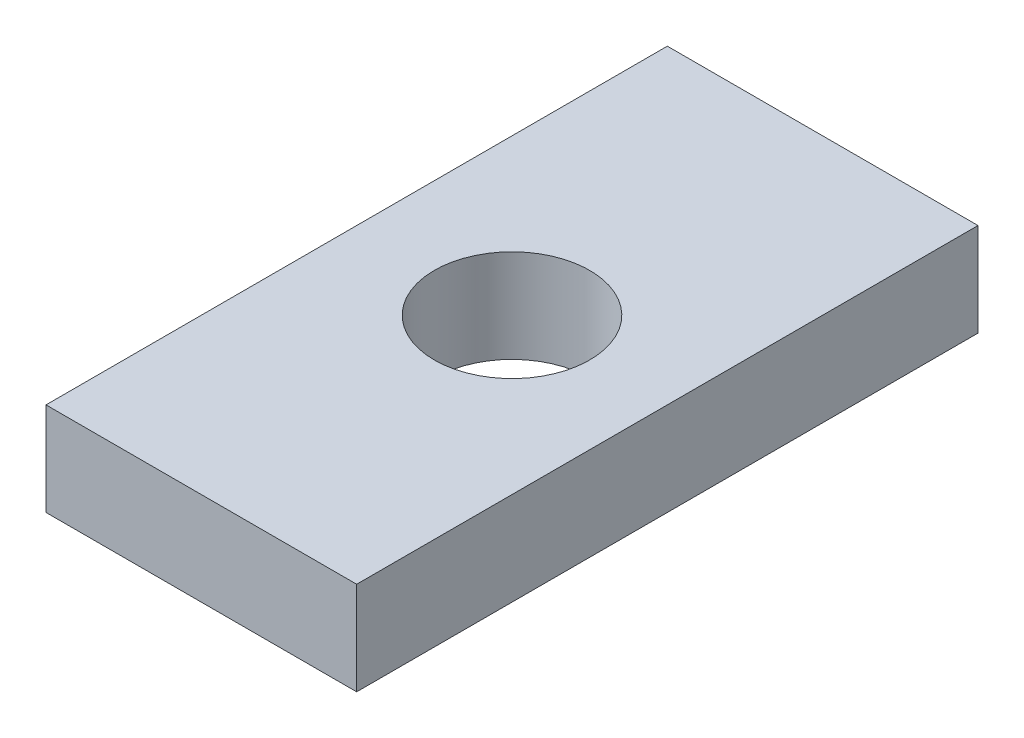
ISO-10303-21;
HEADER;
FILE_DESCRIPTION(('STEP AP214'),'2;1');
FILE_NAME('part.step','',(''),(''),'','','');
FILE_SCHEMA(('AUTOMOTIVE_DESIGN { 1 0 10303 214 1 1 1 1 }'));
ENDSEC;
DATA;
#1=APPLICATION_CONTEXT('core data for automotive mechanical design processes');
#2=APPLICATION_PROTOCOL_DEFINITION('international standard','automotive_design',2000,#1);
#3=PRODUCT_CONTEXT('',#1,'mechanical');
#4=PRODUCT('Part','Part','',(#3));
#5=PRODUCT_RELATED_PRODUCT_CATEGORY('part','',(#4));
#6=PRODUCT_DEFINITION_FORMATION('','',#4);
#7=PRODUCT_DEFINITION_CONTEXT('part definition',#1,'design');
#8=PRODUCT_DEFINITION('design','',#6,#7);
#9=PRODUCT_DEFINITION_SHAPE('','',#8);
#10=(LENGTH_UNIT() NAMED_UNIT(*) SI_UNIT(.MILLI.,.METRE.));
#11=(NAMED_UNIT(*) PLANE_ANGLE_UNIT() SI_UNIT($,.RADIAN.));
#12=(NAMED_UNIT(*) SI_UNIT($,.STERADIAN.) SOLID_ANGLE_UNIT());
#13=UNCERTAINTY_MEASURE_WITH_UNIT(LENGTH_MEASURE(1.E-05),#10,'distance_accuracy_value','');
#14=(GEOMETRIC_REPRESENTATION_CONTEXT(3) GLOBAL_UNCERTAINTY_ASSIGNED_CONTEXT((#13)) GLOBAL_UNIT_ASSIGNED_CONTEXT((#10,
#11,#12)) REPRESENTATION_CONTEXT('',''));
#15=CARTESIAN_POINT('',(0.,0.,0.));
#16=DIRECTION('',(0.,0.,1.));
#17=DIRECTION('',(1.,0.,0.));
#18=AXIS2_PLACEMENT_3D('',#15,#16,#17);
#19=CARTESIAN_POINT('',(0.,3.,0.));
#20=DIRECTION('',(0.,1.,0.));
#21=DIRECTION('',(0.,0.,1.));
#22=AXIS2_PLACEMENT_3D('',#19,#20,#21);
#23=PLANE('',#22);
#24=DIRECTION('',(0.,0.,1.));
#25=VECTOR('',#24,1.);
#26=CARTESIAN_POINT('',(-10.919540229885,3.,-6.60919540229885));
#27=LINE('',#26,#25);
#28=CARTESIAN_POINT('',(-10.919540229885,3.,-6.60919540229885));
#29=VERTEX_POINT('',#28);
#30=CARTESIAN_POINT('',(-10.919540229885,3.,13.3908045977012));
#31=VERTEX_POINT('',#30);
#32=EDGE_CURVE('E85',#29,#31,#27,.T.);
#33=ORIENTED_EDGE('',*,*,#32,.T.);
#34=DIRECTION('',(1.,0.,0.));
#35=VECTOR('',#34,1.);
#36=CARTESIAN_POINT('',(-10.919540229885,3.,13.3908045977012));
#37=LINE('',#36,#35);
#38=CARTESIAN_POINT('',(-0.919540229885045,3.,13.3908045977012));
#39=VERTEX_POINT('',#38);
#40=EDGE_CURVE('E80',#31,#39,#37,.T.);
#41=ORIENTED_EDGE('',*,*,#40,.T.);
#42=DIRECTION('',(0.,0.,-1.));
#43=VECTOR('',#42,1.);
#44=CARTESIAN_POINT('',(-0.919540229885047,3.,-6.60919540229885));
#45=LINE('',#44,#43);
#46=CARTESIAN_POINT('',(-0.919540229885047,3.,-6.60919540229885));
#47=VERTEX_POINT('',#46);
#48=EDGE_CURVE('E83',#39,#47,#45,.T.);
#49=ORIENTED_EDGE('',*,*,#48,.T.);
#50=DIRECTION('',(-1.,0.,0.));
#51=VECTOR('',#50,1.);
#52=CARTESIAN_POINT('',(-10.919540229885,3.,-6.60919540229885));
#53=LINE('',#52,#51);
#54=EDGE_CURVE('E50',#47,#29,#53,.T.);
#55=ORIENTED_EDGE('',*,*,#54,.T.);
#56=EDGE_LOOP('',(#33,#41,#49,#55));
#57=FACE_BOUND('',#56,.T.);
#58=CARTESIAN_POINT('',(-5.91954022988505,3.,3.39080459770115));
#59=DIRECTION('',(0.,1.,0.));
#60=DIRECTION('',(0.,0.,1.));
#61=AXIS2_PLACEMENT_3D('',#58,#59,#60);
#62=CIRCLE('',#61,2.5);
#63=CARTESIAN_POINT('',(-5.91954022988505,3.,5.89080459770115));
#64=VERTEX_POINT('',#63);
#65=EDGE_CURVE('E100',#64,#64,#62,.T.);
#66=ORIENTED_EDGE('',*,*,#65,.F.);
#67=EDGE_LOOP('',(#66));
#68=FACE_BOUND('',#67,.T.);
#69=ADVANCED_FACE('F33',(#57,#68),#23,.T.);
#70=CARTESIAN_POINT('',(0.,0.,0.));
#71=DIRECTION('',(0.,1.,0.));
#72=DIRECTION('',(0.,0.,1.));
#73=AXIS2_PLACEMENT_3D('',#70,#71,#72);
#74=PLANE('',#73);
#75=DIRECTION('',(0.,0.,1.));
#76=VECTOR('',#75,1.);
#77=CARTESIAN_POINT('',(-10.919540229885,0.,-6.60919540229885));
#78=LINE('',#77,#76);
#79=CARTESIAN_POINT('',(-10.919540229885,0.,-6.60919540229885));
#80=VERTEX_POINT('',#79);
#81=CARTESIAN_POINT('',(-10.919540229885,0.,13.3908045977012));
#82=VERTEX_POINT('',#81);
#83=EDGE_CURVE('E97',#80,#82,#78,.T.);
#84=ORIENTED_EDGE('',*,*,#83,.F.);
#85=DIRECTION('',(-1.,0.,0.));
#86=VECTOR('',#85,1.);
#87=CARTESIAN_POINT('',(-10.919540229885,0.,-6.60919540229885));
#88=LINE('',#87,#86);
#89=CARTESIAN_POINT('',(-0.919540229885047,0.,-6.60919540229885));
#90=VERTEX_POINT('',#89);
#91=EDGE_CURVE('E73',#90,#80,#88,.T.);
#92=ORIENTED_EDGE('',*,*,#91,.F.);
#93=DIRECTION('',(0.,0.,-1.));
#94=VECTOR('',#93,1.);
#95=CARTESIAN_POINT('',(-0.919540229885047,0.,-6.60919540229885));
#96=LINE('',#95,#94);
#97=CARTESIAN_POINT('',(-0.919540229885045,0.,13.3908045977012));
#98=VERTEX_POINT('',#97);
#99=EDGE_CURVE('E67',#98,#90,#96,.T.);
#100=ORIENTED_EDGE('',*,*,#99,.F.);
#101=DIRECTION('',(1.,0.,0.));
#102=VECTOR('',#101,1.);
#103=CARTESIAN_POINT('',(-10.919540229885,0.,13.3908045977012));
#104=LINE('',#103,#102);
#105=EDGE_CURVE('E89',#82,#98,#104,.T.);
#106=ORIENTED_EDGE('',*,*,#105,.F.);
#107=EDGE_LOOP('',(#84,#92,#100,#106));
#108=FACE_BOUND('',#107,.T.);
#109=CARTESIAN_POINT('',(-5.91954022988505,0.,3.39080459770115));
#110=DIRECTION('',(0.,1.,0.));
#111=DIRECTION('',(0.,0.,1.));
#112=AXIS2_PLACEMENT_3D('',#109,#110,#111);
#113=CIRCLE('',#112,2.5);
#114=CARTESIAN_POINT('',(-5.91954022988505,0.,5.89080459770115));
#115=VERTEX_POINT('',#114);
#116=EDGE_CURVE('E112',#115,#115,#113,.T.);
#117=ORIENTED_EDGE('',*,*,#116,.T.);
#118=EDGE_LOOP('',(#117));
#119=FACE_BOUND('',#118,.T.);
#120=ADVANCED_FACE('F108',(#108,#119),#74,.F.);
#121=CARTESIAN_POINT('',(-10.919540229885,3.,-6.60919540229885));
#122=DIRECTION('',(1.,0.,0.));
#123=DIRECTION('',(0.,0.,-1.));
#124=AXIS2_PLACEMENT_3D('',#121,#122,#123);
#125=PLANE('',#124);
#126=ORIENTED_EDGE('',*,*,#83,.T.);
#127=DIRECTION('',(0.,-1.,0.));
#128=VECTOR('',#127,1.);
#129=CARTESIAN_POINT('',(-10.919540229885,3.,13.3908045977012));
#130=LINE('',#129,#128);
#131=EDGE_CURVE('E11',#31,#82,#130,.T.);
#132=ORIENTED_EDGE('',*,*,#131,.F.);
#133=ORIENTED_EDGE('',*,*,#32,.F.);
#134=DIRECTION('',(0.,-1.,0.));
#135=VECTOR('',#134,1.);
#136=CARTESIAN_POINT('',(-10.919540229885,3.,-6.60919540229885));
#137=LINE('',#136,#135);
#138=EDGE_CURVE('E93',#29,#80,#137,.T.);
#139=ORIENTED_EDGE('',*,*,#138,.T.);
#140=EDGE_LOOP('',(#126,#132,#133,#139));
#141=FACE_BOUND('',#140,.T.);
#142=ADVANCED_FACE('F35',(#141),#125,.F.);
#143=CARTESIAN_POINT('',(-10.919540229885,3.,13.3908045977012));
#144=DIRECTION('',(0.,0.,-1.));
#145=DIRECTION('',(-1.,0.,0.));
#146=AXIS2_PLACEMENT_3D('',#143,#144,#145);
#147=PLANE('',#146);
#148=ORIENTED_EDGE('',*,*,#105,.T.);
#149=DIRECTION('',(0.,-1.,0.));
#150=VECTOR('',#149,1.);
#151=CARTESIAN_POINT('',(-0.919540229885045,3.,13.3908045977012));
#152=LINE('',#151,#150);
#153=EDGE_CURVE('E42',#39,#98,#152,.T.);
#154=ORIENTED_EDGE('',*,*,#153,.F.);
#155=ORIENTED_EDGE('',*,*,#40,.F.);
#156=ORIENTED_EDGE('',*,*,#131,.T.);
#157=EDGE_LOOP('',(#148,#154,#155,#156));
#158=FACE_BOUND('',#157,.T.);
#159=ADVANCED_FACE('F88',(#158),#147,.F.);
#160=CARTESIAN_POINT('',(-0.919540229885047,3.,-6.60919540229885));
#161=DIRECTION('',(-1.,0.,0.));
#162=DIRECTION('',(0.,0.,1.));
#163=AXIS2_PLACEMENT_3D('',#160,#161,#162);
#164=PLANE('',#163);
#165=ORIENTED_EDGE('',*,*,#99,.T.);
#166=DIRECTION('',(0.,-1.,0.));
#167=VECTOR('',#166,1.);
#168=CARTESIAN_POINT('',(-0.919540229885047,3.,-6.60919540229885));
#169=LINE('',#168,#167);
#170=EDGE_CURVE('E90',#47,#90,#169,.T.);
#171=ORIENTED_EDGE('',*,*,#170,.F.);
#172=ORIENTED_EDGE('',*,*,#48,.F.);
#173=ORIENTED_EDGE('',*,*,#153,.T.);
#174=EDGE_LOOP('',(#165,#171,#172,#173));
#175=FACE_BOUND('',#174,.T.);
#176=ADVANCED_FACE('F91',(#175),#164,.F.);
#177=CARTESIAN_POINT('',(-10.919540229885,3.,-6.60919540229885));
#178=DIRECTION('',(0.,0.,1.));
#179=DIRECTION('',(1.,0.,0.));
#180=AXIS2_PLACEMENT_3D('',#177,#178,#179);
#181=PLANE('',#180);
#182=ORIENTED_EDGE('',*,*,#91,.T.);
#183=ORIENTED_EDGE('',*,*,#138,.F.);
#184=ORIENTED_EDGE('',*,*,#54,.F.);
#185=ORIENTED_EDGE('',*,*,#170,.T.);
#186=EDGE_LOOP('',(#182,#183,#184,#185));
#187=FACE_BOUND('',#186,.T.);
#188=ADVANCED_FACE('F105',(#187),#181,.F.);
#189=CARTESIAN_POINT('',(-5.91954022988505,3.,3.39080459770115));
#190=DIRECTION('',(0.,-1.,0.));
#191=DIRECTION('',(0.,0.,-1.));
#192=AXIS2_PLACEMENT_3D('',#189,#190,#191);
#193=CYLINDRICAL_SURFACE('',#192,2.5);
#194=ORIENTED_EDGE('',*,*,#65,.T.);
#195=EDGE_LOOP('',(#194));
#196=FACE_BOUND('',#195,.T.);
#197=ORIENTED_EDGE('',*,*,#116,.F.);
#198=EDGE_LOOP('',(#197));
#199=FACE_BOUND('',#198,.T.);
#200=ADVANCED_FACE('F118',(#196,#199),#193,.F.);
#201=CLOSED_SHELL('',(#69,#120,#142,#159,#176,#188,#200));
#202=MANIFOLD_SOLID_BREP('B2',#201);
#203=ADVANCED_BREP_SHAPE_REPRESENTATION('',(#18,#202),#14);
#204=SHAPE_DEFINITION_REPRESENTATION(#9,#203);
ENDSEC;
END-ISO-10303-21;
